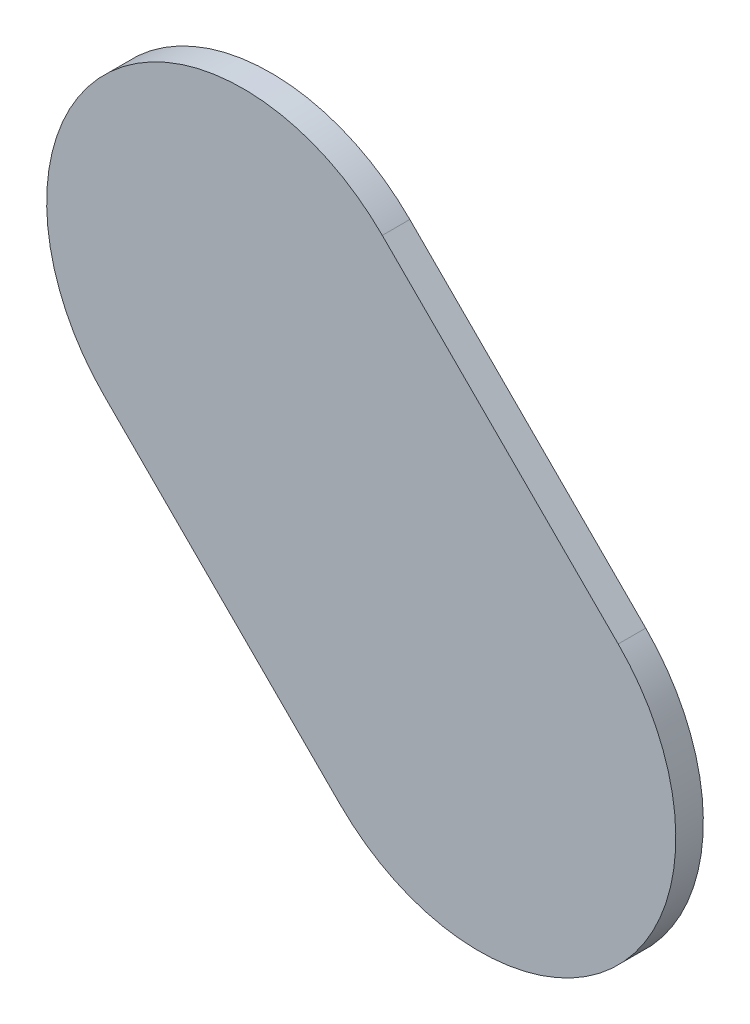
ISO-10303-21;
HEADER;
FILE_DESCRIPTION(('STEP AP214'),'2;1');
FILE_NAME('part.step','',(''),(''),'','','');
FILE_SCHEMA(('AUTOMOTIVE_DESIGN { 1 0 10303 214 1 1 1 1 }'));
ENDSEC;
DATA;
#1=APPLICATION_CONTEXT('core data for automotive mechanical design processes');
#2=APPLICATION_PROTOCOL_DEFINITION('international standard','automotive_design',2000,#1);
#3=PRODUCT_CONTEXT('',#1,'mechanical');
#4=PRODUCT('Part','Part','',(#3));
#5=PRODUCT_RELATED_PRODUCT_CATEGORY('part','',(#4));
#6=PRODUCT_DEFINITION_FORMATION('','',#4);
#7=PRODUCT_DEFINITION_CONTEXT('part definition',#1,'design');
#8=PRODUCT_DEFINITION('design','',#6,#7);
#9=PRODUCT_DEFINITION_SHAPE('','',#8);
#10=(LENGTH_UNIT() NAMED_UNIT(*) SI_UNIT(.MILLI.,.METRE.));
#11=(NAMED_UNIT(*) PLANE_ANGLE_UNIT() SI_UNIT($,.RADIAN.));
#12=(NAMED_UNIT(*) SI_UNIT($,.STERADIAN.) SOLID_ANGLE_UNIT());
#13=UNCERTAINTY_MEASURE_WITH_UNIT(LENGTH_MEASURE(1.E-05),#10,'distance_accuracy_value','');
#14=(GEOMETRIC_REPRESENTATION_CONTEXT(3) GLOBAL_UNCERTAINTY_ASSIGNED_CONTEXT((#13)) GLOBAL_UNIT_ASSIGNED_CONTEXT((#10,
#11,#12)) REPRESENTATION_CONTEXT('',''));
#15=CARTESIAN_POINT('',(0.,0.,0.));
#16=DIRECTION('',(0.,0.,1.));
#17=DIRECTION('',(1.,0.,0.));
#18=AXIS2_PLACEMENT_3D('',#15,#16,#17);
#19=CARTESIAN_POINT('',(80.773223,-120.676776,1.635));
#20=DIRECTION('',(0.,0.,1.));
#21=DIRECTION('',(1.,0.,0.));
#22=AXIS2_PLACEMENT_3D('',#19,#20,#21);
#23=PLANE('',#22);
#24=DIRECTION('',(0.707106781186548,-0.707106781186548,0.));
#25=VECTOR('',#24,1.);
#26=CARTESIAN_POINT('',(80.773223,-120.676776,1.635));
#27=LINE('',#26,#25);
#28=CARTESIAN_POINT('',(80.773223,-120.676776,1.635));
#29=VERTEX_POINT('',#28);
#30=CARTESIAN_POINT('',(81.073223,-120.976776,1.635));
#31=VERTEX_POINT('',#30);
#32=EDGE_CURVE('E83',#29,#31,#27,.T.);
#33=ORIENTED_EDGE('',*,*,#32,.T.);
#34=CARTESIAN_POINT('',(81.2499995,-120.7999995,1.635));
#35=DIRECTION('',(0.,0.,1.));
#36=DIRECTION('',(-0.707106781186548,-0.707106781186548,0.));
#37=AXIS2_PLACEMENT_3D('',#34,#35,#36);
#38=CIRCLE('',#37,0.249999723809);
#39=CARTESIAN_POINT('',(81.426776,-120.623223,1.635));
#40=VERTEX_POINT('',#39);
#41=EDGE_CURVE('E105',#31,#40,#38,.T.);
#42=ORIENTED_EDGE('',*,*,#41,.T.);
#43=DIRECTION('',(-0.707106781186548,0.707106781186548,0.));
#44=VECTOR('',#43,1.);
#45=CARTESIAN_POINT('',(81.426776,-120.623223,1.635));
#46=LINE('',#45,#44);
#47=CARTESIAN_POINT('',(81.126776,-120.323223,1.635));
#48=VERTEX_POINT('',#47);
#49=EDGE_CURVE('E20',#40,#48,#46,.T.);
#50=ORIENTED_EDGE('',*,*,#49,.T.);
#51=CARTESIAN_POINT('',(80.9499995,-120.4999995,1.635));
#52=DIRECTION('',(0.,0.,1.));
#53=DIRECTION('',(0.707106781186548,0.707106781186548,0.));
#54=AXIS2_PLACEMENT_3D('',#51,#52,#53);
#55=CIRCLE('',#54,0.249999723809);
#56=EDGE_CURVE('E11',#48,#29,#55,.T.);
#57=ORIENTED_EDGE('',*,*,#56,.T.);
#58=EDGE_LOOP('',(#33,#42,#50,#57));
#59=FACE_BOUND('',#58,.T.);
#60=ADVANCED_FACE('F17',(#59),#23,.T.);
#61=CARTESIAN_POINT('',(80.773223,-120.676776,1.6));
#62=DIRECTION('',(0.,0.,1.));
#63=DIRECTION('',(1.,0.,0.));
#64=AXIS2_PLACEMENT_3D('',#61,#62,#63);
#65=PLANE('',#64);
#66=CARTESIAN_POINT('',(80.9499995,-120.4999995,1.6));
#67=DIRECTION('',(0.,0.,1.));
#68=DIRECTION('',(0.707106781186548,0.707106781186548,0.));
#69=AXIS2_PLACEMENT_3D('',#66,#67,#68);
#70=CIRCLE('',#69,0.249999723809);
#71=CARTESIAN_POINT('',(81.126776,-120.323223,1.6));
#72=VERTEX_POINT('',#71);
#73=CARTESIAN_POINT('',(80.773223,-120.676776,1.6));
#74=VERTEX_POINT('',#73);
#75=EDGE_CURVE('E26',#72,#74,#70,.T.);
#76=ORIENTED_EDGE('',*,*,#75,.F.);
#77=DIRECTION('',(-0.707106781186548,0.707106781186548,0.));
#78=VECTOR('',#77,1.);
#79=CARTESIAN_POINT('',(81.426776,-120.623223,1.6));
#80=LINE('',#79,#78);
#81=CARTESIAN_POINT('',(81.426776,-120.623223,1.6));
#82=VERTEX_POINT('',#81);
#83=EDGE_CURVE('E111',#82,#72,#80,.T.);
#84=ORIENTED_EDGE('',*,*,#83,.F.);
#85=CARTESIAN_POINT('',(81.2499995,-120.7999995,1.6));
#86=DIRECTION('',(0.,0.,1.));
#87=DIRECTION('',(-0.707106781186548,-0.707106781186548,0.));
#88=AXIS2_PLACEMENT_3D('',#85,#86,#87);
#89=CIRCLE('',#88,0.249999723809);
#90=CARTESIAN_POINT('',(81.073223,-120.976776,1.6));
#91=VERTEX_POINT('',#90);
#92=EDGE_CURVE('E85',#91,#82,#89,.T.);
#93=ORIENTED_EDGE('',*,*,#92,.F.);
#94=DIRECTION('',(0.707106781186548,-0.707106781186548,0.));
#95=VECTOR('',#94,1.);
#96=CARTESIAN_POINT('',(80.773223,-120.676776,1.6));
#97=LINE('',#96,#95);
#98=EDGE_CURVE('E81',#74,#91,#97,.T.);
#99=ORIENTED_EDGE('',*,*,#98,.F.);
#100=EDGE_LOOP('',(#76,#84,#93,#99));
#101=FACE_BOUND('',#100,.T.);
#102=ADVANCED_FACE('F87',(#101),#65,.F.);
#103=CARTESIAN_POINT('',(80.9499995,-120.4999995,1.6));
#104=DIRECTION('',(0.,0.,-1.));
#105=DIRECTION('',(0.707106781186548,0.707106781186548,0.));
#106=AXIS2_PLACEMENT_3D('',#103,#104,#105);
#107=CYLINDRICAL_SURFACE('',#106,0.249999723809);
#108=ORIENTED_EDGE('',*,*,#75,.T.);
#109=DIRECTION('',(0.,0.,1.));
#110=VECTOR('',#109,1.);
#111=CARTESIAN_POINT('',(80.773223,-120.676776,1.6));
#112=LINE('',#111,#110);
#113=EDGE_CURVE('E70',#74,#29,#112,.T.);
#114=ORIENTED_EDGE('',*,*,#113,.T.);
#115=ORIENTED_EDGE('',*,*,#56,.F.);
#116=DIRECTION('',(0.,0.,1.));
#117=VECTOR('',#116,1.);
#118=CARTESIAN_POINT('',(81.126776,-120.323223,1.6));
#119=LINE('',#118,#117);
#120=EDGE_CURVE('E73',#72,#48,#119,.T.);
#121=ORIENTED_EDGE('',*,*,#120,.F.);
#122=EDGE_LOOP('',(#108,#114,#115,#121));
#123=FACE_BOUND('',#122,.T.);
#124=ADVANCED_FACE('F69',(#123),#107,.T.);
#125=CARTESIAN_POINT('',(81.426776,-120.623223,1.6));
#126=DIRECTION('',(-0.707106781186548,-0.707106781186548,0.));
#127=DIRECTION('',(-0.707106781186548,0.707106781186548,0.));
#128=AXIS2_PLACEMENT_3D('',#125,#126,#127);
#129=PLANE('',#128);
#130=ORIENTED_EDGE('',*,*,#83,.T.);
#131=ORIENTED_EDGE('',*,*,#120,.T.);
#132=ORIENTED_EDGE('',*,*,#49,.F.);
#133=DIRECTION('',(0.,0.,1.));
#134=VECTOR('',#133,1.);
#135=CARTESIAN_POINT('',(81.426776,-120.623223,1.6));
#136=LINE('',#135,#134);
#137=EDGE_CURVE('E101',#82,#40,#136,.T.);
#138=ORIENTED_EDGE('',*,*,#137,.F.);
#139=EDGE_LOOP('',(#130,#131,#132,#138));
#140=FACE_BOUND('',#139,.T.);
#141=ADVANCED_FACE('F122',(#140),#129,.F.);
#142=CARTESIAN_POINT('',(81.2499995,-120.7999995,1.6));
#143=DIRECTION('',(0.,0.,-1.));
#144=DIRECTION('',(-0.707106781186548,-0.707106781186548,0.));
#145=AXIS2_PLACEMENT_3D('',#142,#143,#144);
#146=CYLINDRICAL_SURFACE('',#145,0.249999723809);
#147=ORIENTED_EDGE('',*,*,#92,.T.);
#148=ORIENTED_EDGE('',*,*,#137,.T.);
#149=ORIENTED_EDGE('',*,*,#41,.F.);
#150=DIRECTION('',(0.,0.,1.));
#151=VECTOR('',#150,1.);
#152=CARTESIAN_POINT('',(81.073223,-120.976776,1.6));
#153=LINE('',#152,#151);
#154=EDGE_CURVE('E91',#91,#31,#153,.T.);
#155=ORIENTED_EDGE('',*,*,#154,.F.);
#156=EDGE_LOOP('',(#147,#148,#149,#155));
#157=FACE_BOUND('',#156,.T.);
#158=ADVANCED_FACE('F124',(#157),#146,.T.);
#159=CARTESIAN_POINT('',(80.773223,-120.676776,1.6));
#160=DIRECTION('',(0.707106781186548,0.707106781186548,0.));
#161=DIRECTION('',(0.,0.,-1.));
#162=AXIS2_PLACEMENT_3D('',#159,#160,#161);
#163=PLANE('',#162);
#164=ORIENTED_EDGE('',*,*,#98,.T.);
#165=ORIENTED_EDGE('',*,*,#154,.T.);
#166=ORIENTED_EDGE('',*,*,#32,.F.);
#167=ORIENTED_EDGE('',*,*,#113,.F.);
#168=EDGE_LOOP('',(#164,#165,#166,#167));
#169=FACE_BOUND('',#168,.T.);
#170=ADVANCED_FACE('F79',(#169),#163,.F.);
#171=CLOSED_SHELL('',(#60,#102,#124,#141,#158,#170));
#172=MANIFOLD_SOLID_BREP('B1',#171);
#173=ADVANCED_BREP_SHAPE_REPRESENTATION('',(#18,#172),#14);
#174=SHAPE_DEFINITION_REPRESENTATION(#9,#173);
ENDSEC;
END-ISO-10303-21;
